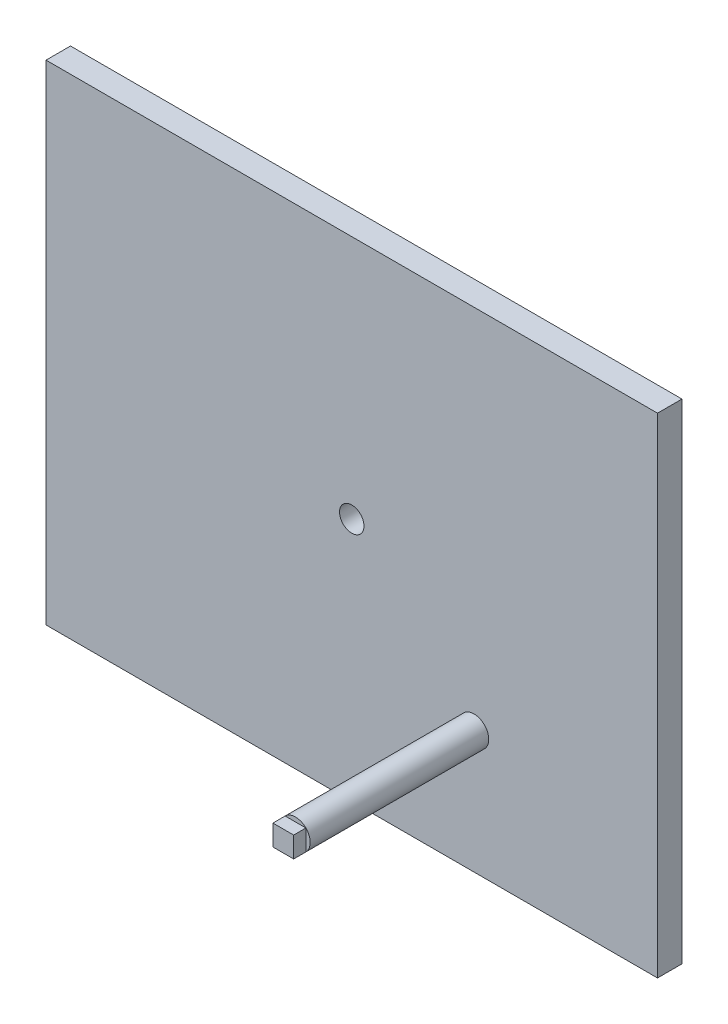
ISO-10303-21;
HEADER;
FILE_DESCRIPTION(('STEP AP214'),'2;1');
FILE_NAME('part.step','',(''),(''),'','','');
FILE_SCHEMA(('AUTOMOTIVE_DESIGN { 1 0 10303 214 1 1 1 1 }'));
ENDSEC;
DATA;
#1=APPLICATION_CONTEXT('core data for automotive mechanical design processes');
#2=APPLICATION_PROTOCOL_DEFINITION('international standard','automotive_design',2000,#1);
#3=PRODUCT_CONTEXT('',#1,'mechanical');
#4=PRODUCT('Part','Part','',(#3));
#5=PRODUCT_RELATED_PRODUCT_CATEGORY('part','',(#4));
#6=PRODUCT_DEFINITION_FORMATION('','',#4);
#7=PRODUCT_DEFINITION_CONTEXT('part definition',#1,'design');
#8=PRODUCT_DEFINITION('design','',#6,#7);
#9=PRODUCT_DEFINITION_SHAPE('','',#8);
#10=(LENGTH_UNIT() NAMED_UNIT(*) SI_UNIT(.MILLI.,.METRE.));
#11=(NAMED_UNIT(*) PLANE_ANGLE_UNIT() SI_UNIT($,.RADIAN.));
#12=(NAMED_UNIT(*) SI_UNIT($,.STERADIAN.) SOLID_ANGLE_UNIT());
#13=UNCERTAINTY_MEASURE_WITH_UNIT(LENGTH_MEASURE(1.E-05),#10,'distance_accuracy_value','');
#14=(GEOMETRIC_REPRESENTATION_CONTEXT(3) GLOBAL_UNCERTAINTY_ASSIGNED_CONTEXT((#13)) GLOBAL_UNIT_ASSIGNED_CONTEXT((#10,
#11,#12)) REPRESENTATION_CONTEXT('',''));
#15=CARTESIAN_POINT('',(0.,0.,0.));
#16=DIRECTION('',(0.,0.,1.));
#17=DIRECTION('',(1.,0.,0.));
#18=AXIS2_PLACEMENT_3D('',#15,#16,#17);
#19=CARTESIAN_POINT('',(500.,-500.,830.));
#20=DIRECTION('',(0.,0.,1.));
#21=DIRECTION('',(1.,0.,0.));
#22=AXIS2_PLACEMENT_3D('',#19,#20,#21);
#23=PLANE('',#22);
#24=DIRECTION('',(0.,-1.,0.));
#25=VECTOR('',#24,1.);
#26=CARTESIAN_POINT('',(457.573593128807,-542.426406871193,830.));
#27=LINE('',#26,#25);
#28=CARTESIAN_POINT('',(457.573593128807,-457.573593128807,830.));
#29=VERTEX_POINT('',#28);
#30=CARTESIAN_POINT('',(457.573593128807,-542.426406871193,830.));
#31=VERTEX_POINT('',#30);
#32=EDGE_CURVE('E56',#29,#31,#27,.T.);
#33=ORIENTED_EDGE('',*,*,#32,.F.);
#34=CARTESIAN_POINT('',(500.,-500.,830.));
#35=DIRECTION('',(0.,0.,1.));
#36=DIRECTION('',(1.,0.,0.));
#37=AXIS2_PLACEMENT_3D('',#34,#35,#36);
#38=CIRCLE('',#37,60.0000000000002);
#39=EDGE_CURVE('E135',#29,#31,#38,.T.);
#40=ORIENTED_EDGE('',*,*,#39,.T.);
#41=EDGE_LOOP('',(#33,#40));
#42=FACE_BOUND('',#41,.T.);
#43=ADVANCED_FACE('F35',(#42),#23,.T.);
#44=DIRECTION('',(-1.,0.,0.));
#45=VECTOR('',#44,1.);
#46=CARTESIAN_POINT('',(542.426406871193,-457.573593128807,830.));
#47=LINE('',#46,#45);
#48=CARTESIAN_POINT('',(542.426406871193,-457.573593128807,830.));
#49=VERTEX_POINT('',#48);
#50=EDGE_CURVE('E120',#49,#29,#47,.T.);
#51=ORIENTED_EDGE('',*,*,#50,.F.);
#52=EDGE_CURVE('E132',#49,#29,#38,.T.);
#53=ORIENTED_EDGE('',*,*,#52,.T.);
#54=EDGE_LOOP('',(#51,#53));
#55=FACE_BOUND('',#54,.T.);
#56=ADVANCED_FACE('F196',(#55),#23,.T.);
#57=DIRECTION('',(0.,1.,0.));
#58=VECTOR('',#57,1.);
#59=CARTESIAN_POINT('',(542.426406871193,-542.426406871193,830.));
#60=LINE('',#59,#58);
#61=CARTESIAN_POINT('',(542.426406871193,-542.426406871193,830.));
#62=VERTEX_POINT('',#61);
#63=EDGE_CURVE('E224',#62,#49,#60,.T.);
#64=ORIENTED_EDGE('',*,*,#63,.F.);
#65=EDGE_CURVE('E126',#62,#49,#38,.T.);
#66=ORIENTED_EDGE('',*,*,#65,.T.);
#67=EDGE_LOOP('',(#64,#66));
#68=FACE_BOUND('',#67,.T.);
#69=ADVANCED_FACE('F202',(#68),#23,.T.);
#70=CARTESIAN_POINT('',(0.,0.,100.));
#71=DIRECTION('',(0.,0.,1.));
#72=DIRECTION('',(1.,0.,0.));
#73=AXIS2_PLACEMENT_3D('',#70,#71,#72);
#74=PLANE('',#73);
#75=CARTESIAN_POINT('',(500.,-500.,100.));
#76=DIRECTION('',(0.,0.,1.));
#77=DIRECTION('',(1.,0.,0.));
#78=AXIS2_PLACEMENT_3D('',#75,#76,#77);
#79=CIRCLE('',#78,60.0000000000002);
#80=CARTESIAN_POINT('',(560.,-500.,100.));
#81=VERTEX_POINT('',#80);
#82=EDGE_CURVE('E123',#81,#81,#79,.T.);
#83=ORIENTED_EDGE('',*,*,#82,.F.);
#84=EDGE_LOOP('',(#83));
#85=FACE_BOUND('',#84,.T.);
#86=DIRECTION('',(0.,-1.,0.));
#87=VECTOR('',#86,1.);
#88=CARTESIAN_POINT('',(-1250.,-1000.,100.));
#89=LINE('',#88,#87);
#90=CARTESIAN_POINT('',(-1250.,1000.,100.));
#91=VERTEX_POINT('',#90);
#92=CARTESIAN_POINT('',(-1250.,-1000.,100.));
#93=VERTEX_POINT('',#92);
#94=EDGE_CURVE('E143',#91,#93,#89,.T.);
#95=ORIENTED_EDGE('',*,*,#94,.T.);
#96=DIRECTION('',(1.,0.,0.));
#97=VECTOR('',#96,1.);
#98=CARTESIAN_POINT('',(1250.,-1000.,100.));
#99=LINE('',#98,#97);
#100=CARTESIAN_POINT('',(1250.,-1000.,100.));
#101=VERTEX_POINT('',#100);
#102=EDGE_CURVE('E146',#93,#101,#99,.T.);
#103=ORIENTED_EDGE('',*,*,#102,.T.);
#104=DIRECTION('',(0.,1.,0.));
#105=VECTOR('',#104,1.);
#106=CARTESIAN_POINT('',(1250.,-1000.,100.));
#107=LINE('',#106,#105);
#108=CARTESIAN_POINT('',(1250.,1000.,100.));
#109=VERTEX_POINT('',#108);
#110=EDGE_CURVE('E149',#101,#109,#107,.T.);
#111=ORIENTED_EDGE('',*,*,#110,.T.);
#112=DIRECTION('',(-1.,0.,0.));
#113=VECTOR('',#112,1.);
#114=CARTESIAN_POINT('',(1250.,1000.,100.));
#115=LINE('',#114,#113);
#116=EDGE_CURVE('E151',#109,#91,#115,.T.);
#117=ORIENTED_EDGE('',*,*,#116,.T.);
#118=EDGE_LOOP('',(#95,#103,#111,#117));
#119=FACE_BOUND('',#118,.T.);
#120=CARTESIAN_POINT('',(0.,0.,100.));
#121=DIRECTION('',(0.,0.,1.));
#122=DIRECTION('',(1.,0.,0.));
#123=AXIS2_PLACEMENT_3D('',#120,#121,#122);
#124=CIRCLE('',#123,50.);
#125=CARTESIAN_POINT('',(50.,0.,100.));
#126=VERTEX_POINT('',#125);
#127=EDGE_CURVE('E137',#126,#126,#124,.T.);
#128=ORIENTED_EDGE('',*,*,#127,.F.);
#129=EDGE_LOOP('',(#128));
#130=FACE_BOUND('',#129,.T.);
#131=ADVANCED_FACE('F186',(#85,#119,#130),#74,.T.);
#132=CARTESIAN_POINT('',(0.,0.,0.));
#133=DIRECTION('',(0.,0.,1.));
#134=DIRECTION('',(1.,0.,0.));
#135=AXIS2_PLACEMENT_3D('',#132,#133,#134);
#136=PLANE('',#135);
#137=DIRECTION('',(0.,-1.,0.));
#138=VECTOR('',#137,1.);
#139=CARTESIAN_POINT('',(-1250.,-1000.,0.));
#140=LINE('',#139,#138);
#141=CARTESIAN_POINT('',(-1250.,1000.,0.));
#142=VERTEX_POINT('',#141);
#143=CARTESIAN_POINT('',(-1250.,-1000.,0.));
#144=VERTEX_POINT('',#143);
#145=EDGE_CURVE('E140',#142,#144,#140,.T.);
#146=ORIENTED_EDGE('',*,*,#145,.F.);
#147=DIRECTION('',(-1.,0.,0.));
#148=VECTOR('',#147,1.);
#149=CARTESIAN_POINT('',(1250.,1000.,0.));
#150=LINE('',#149,#148);
#151=CARTESIAN_POINT('',(1250.,1000.,0.));
#152=VERTEX_POINT('',#151);
#153=EDGE_CURVE('E147',#152,#142,#150,.T.);
#154=ORIENTED_EDGE('',*,*,#153,.F.);
#155=DIRECTION('',(0.,1.,0.));
#156=VECTOR('',#155,1.);
#157=CARTESIAN_POINT('',(1250.,-1000.,0.));
#158=LINE('',#157,#156);
#159=CARTESIAN_POINT('',(1250.,-1000.,0.));
#160=VERTEX_POINT('',#159);
#161=EDGE_CURVE('E158',#160,#152,#158,.T.);
#162=ORIENTED_EDGE('',*,*,#161,.F.);
#163=DIRECTION('',(1.,0.,0.));
#164=VECTOR('',#163,1.);
#165=CARTESIAN_POINT('',(1250.,-1000.,0.));
#166=LINE('',#165,#164);
#167=EDGE_CURVE('E156',#144,#160,#166,.T.);
#168=ORIENTED_EDGE('',*,*,#167,.F.);
#169=EDGE_LOOP('',(#146,#154,#162,#168));
#170=FACE_BOUND('',#169,.T.);
#171=CARTESIAN_POINT('',(0.,0.,0.));
#172=DIRECTION('',(0.,0.,1.));
#173=DIRECTION('',(1.,0.,0.));
#174=AXIS2_PLACEMENT_3D('',#171,#172,#173);
#175=CIRCLE('',#174,50.);
#176=CARTESIAN_POINT('',(50.,0.,0.));
#177=VERTEX_POINT('',#176);
#178=EDGE_CURVE('E134',#177,#177,#175,.T.);
#179=ORIENTED_EDGE('',*,*,#178,.T.);
#180=EDGE_LOOP('',(#179));
#181=FACE_BOUND('',#180,.T.);
#182=ADVANCED_FACE('F176',(#170,#181),#136,.F.);
#183=CARTESIAN_POINT('',(-1250.,-1000.,100.));
#184=DIRECTION('',(1.,0.,0.));
#185=DIRECTION('',(0.,1.,0.));
#186=AXIS2_PLACEMENT_3D('',#183,#184,#185);
#187=PLANE('',#186);
#188=ORIENTED_EDGE('',*,*,#145,.T.);
#189=DIRECTION('',(0.,0.,-1.));
#190=VECTOR('',#189,1.);
#191=CARTESIAN_POINT('',(-1250.,-1000.,100.));
#192=LINE('',#191,#190);
#193=EDGE_CURVE('E11',#93,#144,#192,.T.);
#194=ORIENTED_EDGE('',*,*,#193,.F.);
#195=ORIENTED_EDGE('',*,*,#94,.F.);
#196=DIRECTION('',(0.,0.,-1.));
#197=VECTOR('',#196,1.);
#198=CARTESIAN_POINT('',(-1250.,1000.,100.));
#199=LINE('',#198,#197);
#200=EDGE_CURVE('E153',#91,#142,#199,.T.);
#201=ORIENTED_EDGE('',*,*,#200,.T.);
#202=EDGE_LOOP('',(#188,#194,#195,#201));
#203=FACE_BOUND('',#202,.T.);
#204=ADVANCED_FACE('F37',(#203),#187,.F.);
#205=CARTESIAN_POINT('',(1250.,-1000.,100.));
#206=DIRECTION('',(0.,1.,0.));
#207=DIRECTION('',(-1.,0.,0.));
#208=AXIS2_PLACEMENT_3D('',#205,#206,#207);
#209=PLANE('',#208);
#210=ORIENTED_EDGE('',*,*,#167,.T.);
#211=DIRECTION('',(0.,0.,-1.));
#212=VECTOR('',#211,1.);
#213=CARTESIAN_POINT('',(1250.,-1000.,100.));
#214=LINE('',#213,#212);
#215=EDGE_CURVE('E43',#101,#160,#214,.T.);
#216=ORIENTED_EDGE('',*,*,#215,.F.);
#217=ORIENTED_EDGE('',*,*,#102,.F.);
#218=ORIENTED_EDGE('',*,*,#193,.T.);
#219=EDGE_LOOP('',(#210,#216,#217,#218));
#220=FACE_BOUND('',#219,.T.);
#221=ADVANCED_FACE('F188',(#220),#209,.F.);
#222=CARTESIAN_POINT('',(1250.,-1000.,100.));
#223=DIRECTION('',(-1.,0.,0.));
#224=DIRECTION('',(0.,0.,1.));
#225=AXIS2_PLACEMENT_3D('',#222,#223,#224);
#226=PLANE('',#225);
#227=ORIENTED_EDGE('',*,*,#161,.T.);
#228=DIRECTION('',(0.,0.,-1.));
#229=VECTOR('',#228,1.);
#230=CARTESIAN_POINT('',(1250.,1000.,100.));
#231=LINE('',#230,#229);
#232=EDGE_CURVE('E163',#109,#152,#231,.T.);
#233=ORIENTED_EDGE('',*,*,#232,.F.);
#234=ORIENTED_EDGE('',*,*,#110,.F.);
#235=ORIENTED_EDGE('',*,*,#215,.T.);
#236=EDGE_LOOP('',(#227,#233,#234,#235));
#237=FACE_BOUND('',#236,.T.);
#238=ADVANCED_FACE('F170',(#237),#226,.F.);
#239=CARTESIAN_POINT('',(1250.,1000.,100.));
#240=DIRECTION('',(0.,-1.,0.));
#241=DIRECTION('',(1.,0.,0.));
#242=AXIS2_PLACEMENT_3D('',#239,#240,#241);
#243=PLANE('',#242);
#244=ORIENTED_EDGE('',*,*,#153,.T.);
#245=ORIENTED_EDGE('',*,*,#200,.F.);
#246=ORIENTED_EDGE('',*,*,#116,.F.);
#247=ORIENTED_EDGE('',*,*,#232,.T.);
#248=EDGE_LOOP('',(#244,#245,#246,#247));
#249=FACE_BOUND('',#248,.T.);
#250=ADVANCED_FACE('F180',(#249),#243,.F.);
#251=CARTESIAN_POINT('',(0.,0.,100.));
#252=DIRECTION('',(0.,0.,-1.));
#253=DIRECTION('',(-1.,0.,0.));
#254=AXIS2_PLACEMENT_3D('',#251,#252,#253);
#255=CYLINDRICAL_SURFACE('',#254,50.);
#256=ORIENTED_EDGE('',*,*,#127,.T.);
#257=EDGE_LOOP('',(#256));
#258=FACE_BOUND('',#257,.T.);
#259=ORIENTED_EDGE('',*,*,#178,.F.);
#260=EDGE_LOOP('',(#259));
#261=FACE_BOUND('',#260,.T.);
#262=ADVANCED_FACE('F212',(#258,#261),#255,.F.);
#263=CARTESIAN_POINT('',(500.,-500.,830.));
#264=DIRECTION('',(0.,0.,-1.));
#265=DIRECTION('',(-1.,0.,0.));
#266=AXIS2_PLACEMENT_3D('',#263,#264,#265);
#267=CYLINDRICAL_SURFACE('',#266,60.0000000000002);
#268=ORIENTED_EDGE('',*,*,#52,.F.);
#269=ORIENTED_EDGE('',*,*,#65,.F.);
#270=EDGE_CURVE('E243',#31,#62,#38,.T.);
#271=ORIENTED_EDGE('',*,*,#270,.F.);
#272=ORIENTED_EDGE('',*,*,#39,.F.);
#273=EDGE_LOOP('',(#268,#269,#271,#272));
#274=FACE_BOUND('',#273,.T.);
#275=ORIENTED_EDGE('',*,*,#82,.T.);
#276=EDGE_LOOP('',(#275));
#277=FACE_BOUND('',#276,.T.);
#278=ADVANCED_FACE('F207',(#274,#277),#267,.T.);
#279=DIRECTION('',(1.,0.,0.));
#280=VECTOR('',#279,1.);
#281=CARTESIAN_POINT('',(542.426406871193,-542.426406871193,830.));
#282=LINE('',#281,#280);
#283=EDGE_CURVE('E49',#31,#62,#282,.T.);
#284=ORIENTED_EDGE('',*,*,#283,.F.);
#285=ORIENTED_EDGE('',*,*,#270,.T.);
#286=EDGE_LOOP('',(#284,#285));
#287=FACE_BOUND('',#286,.T.);
#288=ADVANCED_FACE('F198',(#287),#23,.T.);
#289=CARTESIAN_POINT('',(457.573593128807,-542.426406871193,880.));
#290=DIRECTION('',(1.,0.,0.));
#291=DIRECTION('',(0.,0.,-1.));
#292=AXIS2_PLACEMENT_3D('',#289,#290,#291);
#293=PLANE('',#292);
#294=ORIENTED_EDGE('',*,*,#32,.T.);
#295=DIRECTION('',(0.,0.,-1.));
#296=VECTOR('',#295,1.);
#297=CARTESIAN_POINT('',(457.573593128807,-542.426406871193,880.));
#298=LINE('',#297,#296);
#299=CARTESIAN_POINT('',(457.573593128807,-542.426406871193,880.));
#300=VERTEX_POINT('',#299);
#301=EDGE_CURVE('E105',#300,#31,#298,.T.);
#302=ORIENTED_EDGE('',*,*,#301,.F.);
#303=DIRECTION('',(0.,-1.,0.));
#304=VECTOR('',#303,1.);
#305=CARTESIAN_POINT('',(457.573593128807,-542.426406871193,880.));
#306=LINE('',#305,#304);
#307=CARTESIAN_POINT('',(457.573593128807,-457.573593128807,880.));
#308=VERTEX_POINT('',#307);
#309=EDGE_CURVE('E111',#308,#300,#306,.T.);
#310=ORIENTED_EDGE('',*,*,#309,.F.);
#311=DIRECTION('',(0.,0.,-1.));
#312=VECTOR('',#311,1.);
#313=CARTESIAN_POINT('',(457.573593128807,-457.573593128807,880.));
#314=LINE('',#313,#312);
#315=EDGE_CURVE('E234',#308,#29,#314,.T.);
#316=ORIENTED_EDGE('',*,*,#315,.T.);
#317=EDGE_LOOP('',(#294,#302,#310,#316));
#318=FACE_BOUND('',#317,.T.);
#319=ADVANCED_FACE('F122',(#318),#293,.F.);
#320=CARTESIAN_POINT('',(542.426406871193,-542.426406871193,880.));
#321=DIRECTION('',(0.,1.,0.));
#322=DIRECTION('',(0.,0.,1.));
#323=AXIS2_PLACEMENT_3D('',#320,#321,#322);
#324=PLANE('',#323);
#325=ORIENTED_EDGE('',*,*,#283,.T.);
#326=DIRECTION('',(0.,0.,-1.));
#327=VECTOR('',#326,1.);
#328=CARTESIAN_POINT('',(542.426406871193,-542.426406871193,880.));
#329=LINE('',#328,#327);
#330=CARTESIAN_POINT('',(542.426406871193,-542.426406871193,880.));
#331=VERTEX_POINT('',#330);
#332=EDGE_CURVE('E107',#331,#62,#329,.T.);
#333=ORIENTED_EDGE('',*,*,#332,.F.);
#334=DIRECTION('',(1.,0.,0.));
#335=VECTOR('',#334,1.);
#336=CARTESIAN_POINT('',(542.426406871193,-542.426406871193,880.));
#337=LINE('',#336,#335);
#338=EDGE_CURVE('E101',#300,#331,#337,.T.);
#339=ORIENTED_EDGE('',*,*,#338,.F.);
#340=ORIENTED_EDGE('',*,*,#301,.T.);
#341=EDGE_LOOP('',(#325,#333,#339,#340));
#342=FACE_BOUND('',#341,.T.);
#343=ADVANCED_FACE('F103',(#342),#324,.F.);
#344=CARTESIAN_POINT('',(542.426406871193,-542.426406871193,880.));
#345=DIRECTION('',(-1.,0.,0.));
#346=DIRECTION('',(0.,0.,1.));
#347=AXIS2_PLACEMENT_3D('',#344,#345,#346);
#348=PLANE('',#347);
#349=ORIENTED_EDGE('',*,*,#63,.T.);
#350=DIRECTION('',(0.,0.,-1.));
#351=VECTOR('',#350,1.);
#352=CARTESIAN_POINT('',(542.426406871193,-457.573593128807,880.));
#353=LINE('',#352,#351);
#354=CARTESIAN_POINT('',(542.426406871193,-457.573593128807,880.));
#355=VERTEX_POINT('',#354);
#356=EDGE_CURVE('E128',#355,#49,#353,.T.);
#357=ORIENTED_EDGE('',*,*,#356,.F.);
#358=DIRECTION('',(0.,1.,0.));
#359=VECTOR('',#358,1.);
#360=CARTESIAN_POINT('',(542.426406871193,-542.426406871193,880.));
#361=LINE('',#360,#359);
#362=EDGE_CURVE('E110',#331,#355,#361,.T.);
#363=ORIENTED_EDGE('',*,*,#362,.F.);
#364=ORIENTED_EDGE('',*,*,#332,.T.);
#365=EDGE_LOOP('',(#349,#357,#363,#364));
#366=FACE_BOUND('',#365,.T.);
#367=ADVANCED_FACE('F232',(#366),#348,.F.);
#368=CARTESIAN_POINT('',(542.426406871193,-457.573593128807,880.));
#369=DIRECTION('',(0.,-1.,0.));
#370=DIRECTION('',(0.,0.,-1.));
#371=AXIS2_PLACEMENT_3D('',#368,#369,#370);
#372=PLANE('',#371);
#373=ORIENTED_EDGE('',*,*,#50,.T.);
#374=ORIENTED_EDGE('',*,*,#315,.F.);
#375=DIRECTION('',(-1.,0.,0.));
#376=VECTOR('',#375,1.);
#377=CARTESIAN_POINT('',(542.426406871193,-457.573593128807,880.));
#378=LINE('',#377,#376);
#379=EDGE_CURVE('E116',#355,#308,#378,.T.);
#380=ORIENTED_EDGE('',*,*,#379,.F.);
#381=ORIENTED_EDGE('',*,*,#356,.T.);
#382=EDGE_LOOP('',(#373,#374,#380,#381));
#383=FACE_BOUND('',#382,.T.);
#384=ADVANCED_FACE('F241',(#383),#372,.F.);
#385=CARTESIAN_POINT('',(0.,0.,880.));
#386=DIRECTION('',(0.,0.,1.));
#387=DIRECTION('',(1.,0.,0.));
#388=AXIS2_PLACEMENT_3D('',#385,#386,#387);
#389=PLANE('',#388);
#390=ORIENTED_EDGE('',*,*,#309,.T.);
#391=ORIENTED_EDGE('',*,*,#338,.T.);
#392=ORIENTED_EDGE('',*,*,#362,.T.);
#393=ORIENTED_EDGE('',*,*,#379,.T.);
#394=EDGE_LOOP('',(#390,#391,#392,#393));
#395=FACE_BOUND('',#394,.T.);
#396=ADVANCED_FACE('F114',(#395),#389,.T.);
#397=CLOSED_SHELL('',(#43,#56,#69,#131,#182,#204,#221,#238,#250,#262,#278,#288,#319,#343,#367,
#384,#396));
#398=MANIFOLD_SOLID_BREP('B2',#397);
#399=ADVANCED_BREP_SHAPE_REPRESENTATION('',(#18,#398),#14);
#400=SHAPE_DEFINITION_REPRESENTATION(#9,#399);
ENDSEC;
END-ISO-10303-21;
